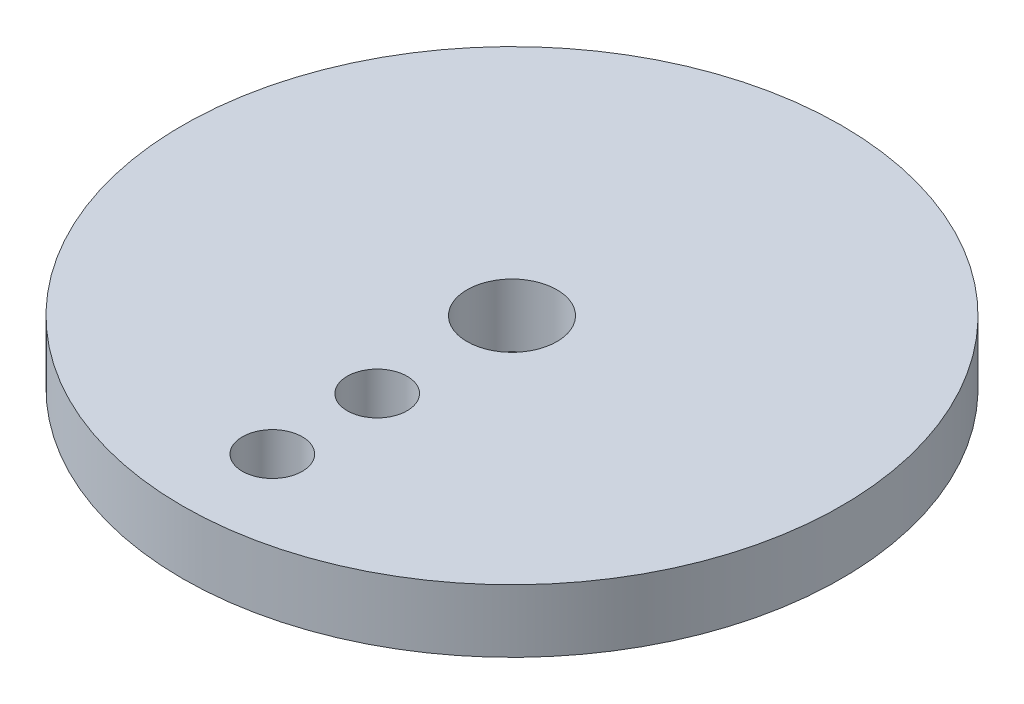
ISO-10303-21;
HEADER;
FILE_DESCRIPTION(('STEP AP214'),'2;1');
FILE_NAME('part.step','',(''),(''),'','','');
FILE_SCHEMA(('AUTOMOTIVE_DESIGN { 1 0 10303 214 1 1 1 1 }'));
ENDSEC;
DATA;
#1=APPLICATION_CONTEXT('core data for automotive mechanical design processes');
#2=APPLICATION_PROTOCOL_DEFINITION('international standard','automotive_design',2000,#1);
#3=PRODUCT_CONTEXT('',#1,'mechanical');
#4=PRODUCT('Part','Part','',(#3));
#5=PRODUCT_RELATED_PRODUCT_CATEGORY('part','',(#4));
#6=PRODUCT_DEFINITION_FORMATION('','',#4);
#7=PRODUCT_DEFINITION_CONTEXT('part definition',#1,'design');
#8=PRODUCT_DEFINITION('design','',#6,#7);
#9=PRODUCT_DEFINITION_SHAPE('','',#8);
#10=(LENGTH_UNIT() NAMED_UNIT(*) SI_UNIT(.MILLI.,.METRE.));
#11=(NAMED_UNIT(*) PLANE_ANGLE_UNIT() SI_UNIT($,.RADIAN.));
#12=(NAMED_UNIT(*) SI_UNIT($,.STERADIAN.) SOLID_ANGLE_UNIT());
#13=UNCERTAINTY_MEASURE_WITH_UNIT(LENGTH_MEASURE(1.E-05),#10,'distance_accuracy_value','');
#14=(GEOMETRIC_REPRESENTATION_CONTEXT(3) GLOBAL_UNCERTAINTY_ASSIGNED_CONTEXT((#13)) GLOBAL_UNIT_ASSIGNED_CONTEXT((#10,
#11,#12)) REPRESENTATION_CONTEXT('',''));
#15=CARTESIAN_POINT('',(0.,0.,0.));
#16=DIRECTION('',(0.,0.,1.));
#17=DIRECTION('',(1.,0.,0.));
#18=AXIS2_PLACEMENT_3D('',#15,#16,#17);
#19=CARTESIAN_POINT('',(0.,2.1,-11.5));
#20=DIRECTION('',(0.,-1.,0.));
#21=DIRECTION('',(0.,0.,-1.));
#22=AXIS2_PLACEMENT_3D('',#19,#20,#21);
#23=CYLINDRICAL_SURFACE('',#22,1.5);
#24=CARTESIAN_POINT('',(0.,2.1,-11.5));
#25=DIRECTION('',(0.,1.,0.));
#26=DIRECTION('',(0.,0.,1.));
#27=AXIS2_PLACEMENT_3D('',#24,#25,#26);
#28=CIRCLE('',#27,1.5);
#29=CARTESIAN_POINT('',(0.,2.1,-10.));
#30=VERTEX_POINT('',#29);
#31=EDGE_CURVE('E41',#30,#30,#28,.T.);
#32=ORIENTED_EDGE('',*,*,#31,.T.);
#33=EDGE_LOOP('',(#32));
#34=FACE_BOUND('',#33,.T.);
#35=CARTESIAN_POINT('',(0.,0.,-11.5));
#36=DIRECTION('',(0.,1.,0.));
#37=DIRECTION('',(0.,0.,1.));
#38=AXIS2_PLACEMENT_3D('',#35,#36,#37);
#39=CIRCLE('',#38,1.5);
#40=CARTESIAN_POINT('',(0.,0.,-10.));
#41=VERTEX_POINT('',#40);
#42=EDGE_CURVE('E56',#41,#41,#39,.T.);
#43=ORIENTED_EDGE('',*,*,#42,.F.);
#44=EDGE_LOOP('',(#43));
#45=FACE_BOUND('',#44,.T.);
#46=ADVANCED_FACE('F33',(#34,#45),#23,.F.);
#47=CARTESIAN_POINT('',(0.,2.1,-11.5));
#48=DIRECTION('',(0.,-1.,0.));
#49=DIRECTION('',(0.,0.,-1.));
#50=AXIS2_PLACEMENT_3D('',#47,#48,#49);
#51=CYLINDRICAL_SURFACE('',#50,11.);
#52=CARTESIAN_POINT('',(0.,2.1,-11.5));
#53=DIRECTION('',(0.,1.,0.));
#54=DIRECTION('',(0.,0.,1.));
#55=AXIS2_PLACEMENT_3D('',#52,#53,#54);
#56=CIRCLE('',#55,11.);
#57=CARTESIAN_POINT('',(0.,2.1,-0.5));
#58=VERTEX_POINT('',#57);
#59=EDGE_CURVE('E45',#58,#58,#56,.T.);
#60=ORIENTED_EDGE('',*,*,#59,.F.);
#61=EDGE_LOOP('',(#60));
#62=FACE_BOUND('',#61,.T.);
#63=CARTESIAN_POINT('',(0.,0.,-11.5));
#64=DIRECTION('',(0.,1.,0.));
#65=DIRECTION('',(0.,0.,1.));
#66=AXIS2_PLACEMENT_3D('',#63,#64,#65);
#67=CIRCLE('',#66,11.);
#68=CARTESIAN_POINT('',(0.,0.,-0.5));
#69=VERTEX_POINT('',#68);
#70=EDGE_CURVE('E54',#69,#69,#67,.T.);
#71=ORIENTED_EDGE('',*,*,#70,.T.);
#72=EDGE_LOOP('',(#71));
#73=FACE_BOUND('',#72,.T.);
#74=ADVANCED_FACE('F78',(#62,#73),#51,.T.);
#75=CARTESIAN_POINT('',(0.,2.1,-3.5));
#76=DIRECTION('',(0.,-1.,0.));
#77=DIRECTION('',(0.,0.,-1.));
#78=AXIS2_PLACEMENT_3D('',#75,#76,#77);
#79=CYLINDRICAL_SURFACE('',#78,1.);
#80=CARTESIAN_POINT('',(0.,2.1,-3.5));
#81=DIRECTION('',(0.,1.,0.));
#82=DIRECTION('',(0.,0.,1.));
#83=AXIS2_PLACEMENT_3D('',#80,#81,#82);
#84=CIRCLE('',#83,1.);
#85=CARTESIAN_POINT('',(0.,2.1,-2.5));
#86=VERTEX_POINT('',#85);
#87=EDGE_CURVE('E61',#86,#86,#84,.T.);
#88=ORIENTED_EDGE('',*,*,#87,.T.);
#89=EDGE_LOOP('',(#88));
#90=FACE_BOUND('',#89,.T.);
#91=CARTESIAN_POINT('',(0.,0.,-3.5));
#92=DIRECTION('',(0.,1.,0.));
#93=DIRECTION('',(0.,0.,1.));
#94=AXIS2_PLACEMENT_3D('',#91,#92,#93);
#95=CIRCLE('',#94,1.);
#96=CARTESIAN_POINT('',(0.,0.,-2.5));
#97=VERTEX_POINT('',#96);
#98=EDGE_CURVE('E51',#97,#97,#95,.T.);
#99=ORIENTED_EDGE('',*,*,#98,.F.);
#100=EDGE_LOOP('',(#99));
#101=FACE_BOUND('',#100,.T.);
#102=ADVANCED_FACE('F35',(#90,#101),#79,.F.);
#103=CARTESIAN_POINT('',(0.,2.1,-7.));
#104=DIRECTION('',(0.,-1.,0.));
#105=DIRECTION('',(0.,0.,-1.));
#106=AXIS2_PLACEMENT_3D('',#103,#104,#105);
#107=CYLINDRICAL_SURFACE('',#106,1.);
#108=CARTESIAN_POINT('',(0.,2.1,-7.));
#109=DIRECTION('',(0.,1.,0.));
#110=DIRECTION('',(0.,0.,1.));
#111=AXIS2_PLACEMENT_3D('',#108,#109,#110);
#112=CIRCLE('',#111,1.);
#113=CARTESIAN_POINT('',(0.,2.1,-6.));
#114=VERTEX_POINT('',#113);
#115=EDGE_CURVE('E11',#114,#114,#112,.T.);
#116=ORIENTED_EDGE('',*,*,#115,.T.);
#117=EDGE_LOOP('',(#116));
#118=FACE_BOUND('',#117,.T.);
#119=CARTESIAN_POINT('',(0.,0.,-7.));
#120=DIRECTION('',(0.,1.,0.));
#121=DIRECTION('',(0.,0.,1.));
#122=AXIS2_PLACEMENT_3D('',#119,#120,#121);
#123=CIRCLE('',#122,1.);
#124=CARTESIAN_POINT('',(0.,0.,-6.));
#125=VERTEX_POINT('',#124);
#126=EDGE_CURVE('E37',#125,#125,#123,.T.);
#127=ORIENTED_EDGE('',*,*,#126,.F.);
#128=EDGE_LOOP('',(#127));
#129=FACE_BOUND('',#128,.T.);
#130=ADVANCED_FACE('F90',(#118,#129),#107,.F.);
#131=CARTESIAN_POINT('',(0.,2.1,0.));
#132=DIRECTION('',(0.,1.,0.));
#133=DIRECTION('',(0.,0.,1.));
#134=AXIS2_PLACEMENT_3D('',#131,#132,#133);
#135=PLANE('',#134);
#136=ORIENTED_EDGE('',*,*,#87,.F.);
#137=EDGE_LOOP('',(#136));
#138=FACE_BOUND('',#137,.T.);
#139=ORIENTED_EDGE('',*,*,#59,.T.);
#140=EDGE_LOOP('',(#139));
#141=FACE_BOUND('',#140,.T.);
#142=ORIENTED_EDGE('',*,*,#31,.F.);
#143=EDGE_LOOP('',(#142));
#144=FACE_BOUND('',#143,.T.);
#145=ORIENTED_EDGE('',*,*,#115,.F.);
#146=EDGE_LOOP('',(#145));
#147=FACE_BOUND('',#146,.T.);
#148=ADVANCED_FACE('F75',(#138,#141,#144,#147),#135,.T.);
#149=CARTESIAN_POINT('',(0.,0.,0.));
#150=DIRECTION('',(0.,1.,0.));
#151=DIRECTION('',(0.,0.,1.));
#152=AXIS2_PLACEMENT_3D('',#149,#150,#151);
#153=PLANE('',#152);
#154=ORIENTED_EDGE('',*,*,#98,.T.);
#155=EDGE_LOOP('',(#154));
#156=FACE_BOUND('',#155,.T.);
#157=ORIENTED_EDGE('',*,*,#70,.F.);
#158=EDGE_LOOP('',(#157));
#159=FACE_BOUND('',#158,.T.);
#160=ORIENTED_EDGE('',*,*,#42,.T.);
#161=EDGE_LOOP('',(#160));
#162=FACE_BOUND('',#161,.T.);
#163=ORIENTED_EDGE('',*,*,#126,.T.);
#164=EDGE_LOOP('',(#163));
#165=FACE_BOUND('',#164,.T.);
#166=ADVANCED_FACE('F83',(#156,#159,#162,#165),#153,.F.);
#167=CLOSED_SHELL('',(#46,#74,#102,#130,#148,#166));
#168=MANIFOLD_SOLID_BREP('B2',#167);
#169=ADVANCED_BREP_SHAPE_REPRESENTATION('',(#18,#168),#14);
#170=SHAPE_DEFINITION_REPRESENTATION(#9,#169);
ENDSEC;
END-ISO-10303-21;
